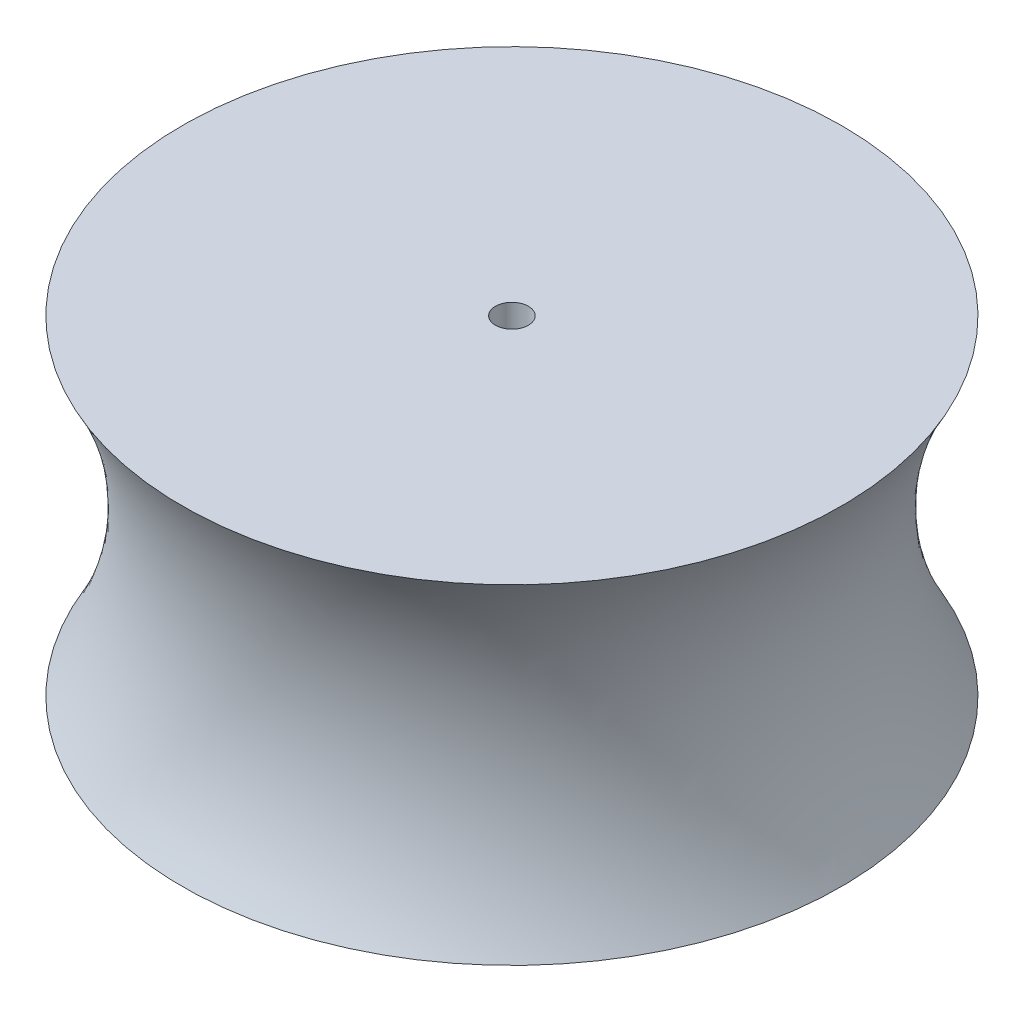
ISO-10303-21;
HEADER;
FILE_DESCRIPTION(('STEP AP214'),'2;1');
FILE_NAME('part.step','',(''),(''),'','','');
FILE_SCHEMA(('AUTOMOTIVE_DESIGN { 1 0 10303 214 1 1 1 1 }'));
ENDSEC;
DATA;
#1=APPLICATION_CONTEXT('core data for automotive mechanical design processes');
#2=APPLICATION_PROTOCOL_DEFINITION('international standard','automotive_design',2000,#1);
#3=PRODUCT_CONTEXT('',#1,'mechanical');
#4=PRODUCT('Part','Part','',(#3));
#5=PRODUCT_RELATED_PRODUCT_CATEGORY('part','',(#4));
#6=PRODUCT_DEFINITION_FORMATION('','',#4);
#7=PRODUCT_DEFINITION_CONTEXT('part definition',#1,'design');
#8=PRODUCT_DEFINITION('design','',#6,#7);
#9=PRODUCT_DEFINITION_SHAPE('','',#8);
#10=(LENGTH_UNIT() NAMED_UNIT(*) SI_UNIT(.MILLI.,.METRE.));
#11=(NAMED_UNIT(*) PLANE_ANGLE_UNIT() SI_UNIT($,.RADIAN.));
#12=(NAMED_UNIT(*) SI_UNIT($,.STERADIAN.) SOLID_ANGLE_UNIT());
#13=UNCERTAINTY_MEASURE_WITH_UNIT(LENGTH_MEASURE(1.E-05),#10,'distance_accuracy_value','');
#14=(GEOMETRIC_REPRESENTATION_CONTEXT(3) GLOBAL_UNCERTAINTY_ASSIGNED_CONTEXT((#13)) GLOBAL_UNIT_ASSIGNED_CONTEXT((#10,
#11,#12)) REPRESENTATION_CONTEXT('',''));
#15=CARTESIAN_POINT('',(0.,0.,0.));
#16=DIRECTION('',(0.,0.,1.));
#17=DIRECTION('',(1.,0.,0.));
#18=AXIS2_PLACEMENT_3D('',#15,#16,#17);
#19=CARTESIAN_POINT('',(0.,20.,0.));
#20=DIRECTION('',(0.,1.,0.));
#21=DIRECTION('',(0.,0.,1.));
#22=AXIS2_PLACEMENT_3D('',#19,#20,#21);
#23=PLANE('',#22);
#24=CARTESIAN_POINT('',(0.,20.,0.));
#25=DIRECTION('',(0.,1.,0.));
#26=DIRECTION('',(0.,0.,1.));
#27=AXIS2_PLACEMENT_3D('',#24,#25,#26);
#28=CIRCLE('',#27,1.);
#29=CARTESIAN_POINT('',(0.,20.,1.));
#30=VERTEX_POINT('',#29);
#31=EDGE_CURVE('E55',#30,#30,#28,.T.);
#32=ORIENTED_EDGE('',*,*,#31,.F.);
#33=EDGE_LOOP('',(#32));
#34=FACE_BOUND('',#33,.T.);
#35=CARTESIAN_POINT('',(0.,20.,0.));
#36=DIRECTION('',(0.,-1.,0.));
#37=DIRECTION('',(0.,0.,-1.));
#38=AXIS2_PLACEMENT_3D('',#35,#36,#37);
#39=CIRCLE('',#38,20.);
#40=CARTESIAN_POINT('',(0.,20.,-20.));
#41=VERTEX_POINT('',#40);
#42=EDGE_CURVE('E10',#41,#41,#39,.T.);
#43=ORIENTED_EDGE('',*,*,#42,.F.);
#44=EDGE_LOOP('',(#43));
#45=FACE_BOUND('',#44,.T.);
#46=ADVANCED_FACE('F37',(#34,#45),#23,.T.);
#47=CARTESIAN_POINT('',(0.,10.,0.));
#48=DIRECTION('',(0.,-1.,0.));
#49=DIRECTION('',(0.,0.,-1.));
#50=AXIS2_PLACEMENT_3D('',#47,#48,#49);
#51=TOROIDAL_SURFACE('',#50,37.3205080756888,20.);
#52=ORIENTED_EDGE('',*,*,#42,.T.);
#53=EDGE_LOOP('',(#52));
#54=FACE_BOUND('',#53,.T.);
#55=CARTESIAN_POINT('',(0.,0.,0.));
#56=DIRECTION('',(0.,-1.,0.));
#57=DIRECTION('',(0.,0.,-1.));
#58=AXIS2_PLACEMENT_3D('',#55,#56,#57);
#59=CIRCLE('',#58,20.);
#60=CARTESIAN_POINT('',(0.,0.,-20.));
#61=VERTEX_POINT('',#60);
#62=EDGE_CURVE('E45',#61,#61,#59,.T.);
#63=ORIENTED_EDGE('',*,*,#62,.F.);
#64=EDGE_LOOP('',(#63));
#65=FACE_BOUND('',#64,.T.);
#66=ADVANCED_FACE('F66',(#54,#65),#51,.F.);
#67=CARTESIAN_POINT('',(0.,0.,0.));
#68=DIRECTION('',(0.,1.,0.));
#69=DIRECTION('',(0.,0.,1.));
#70=AXIS2_PLACEMENT_3D('',#67,#68,#69);
#71=PLANE('',#70);
#72=CARTESIAN_POINT('',(0.,0.,0.));
#73=DIRECTION('',(0.,1.,0.));
#74=DIRECTION('',(0.,0.,1.));
#75=AXIS2_PLACEMENT_3D('',#72,#73,#74);
#76=CIRCLE('',#75,1.);
#77=CARTESIAN_POINT('',(0.,0.,1.));
#78=VERTEX_POINT('',#77);
#79=EDGE_CURVE('E50',#78,#78,#76,.T.);
#80=ORIENTED_EDGE('',*,*,#79,.T.);
#81=EDGE_LOOP('',(#80));
#82=FACE_BOUND('',#81,.T.);
#83=ORIENTED_EDGE('',*,*,#62,.T.);
#84=EDGE_LOOP('',(#83));
#85=FACE_BOUND('',#84,.T.);
#86=ADVANCED_FACE('F39',(#82,#85),#71,.F.);
#87=CARTESIAN_POINT('',(0.,0.,0.));
#88=DIRECTION('',(0.,1.,0.));
#89=DIRECTION('',(0.,0.,1.));
#90=AXIS2_PLACEMENT_3D('',#87,#88,#89);
#91=CYLINDRICAL_SURFACE('',#90,1.);
#92=ORIENTED_EDGE('',*,*,#79,.F.);
#93=EDGE_LOOP('',(#92));
#94=FACE_BOUND('',#93,.T.);
#95=ORIENTED_EDGE('',*,*,#31,.T.);
#96=EDGE_LOOP('',(#95));
#97=FACE_BOUND('',#96,.T.);
#98=ADVANCED_FACE('F62',(#94,#97),#91,.F.);
#99=CLOSED_SHELL('',(#46,#66,#86,#98));
#100=MANIFOLD_SOLID_BREP('B2',#99);
#101=ADVANCED_BREP_SHAPE_REPRESENTATION('',(#18,#100),#14);
#102=SHAPE_DEFINITION_REPRESENTATION(#9,#101);
ENDSEC;
END-ISO-10303-21;
